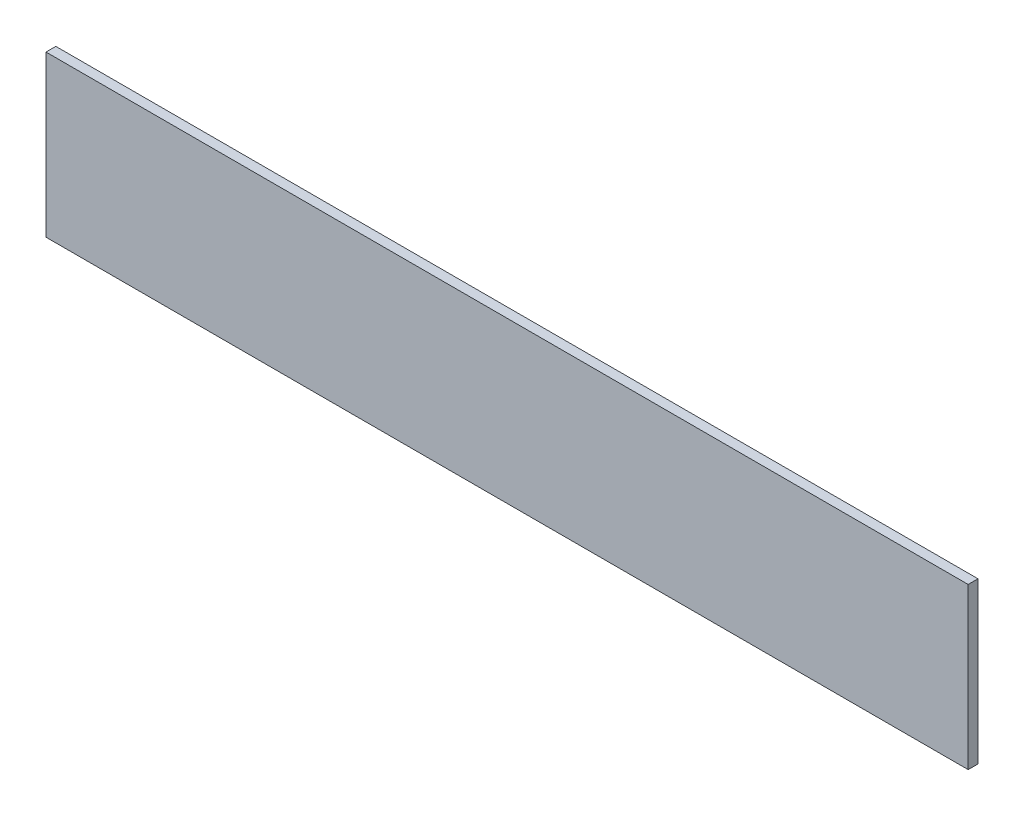
ISO-10303-21;
HEADER;
FILE_DESCRIPTION(('STEP AP214'),'2;1');
FILE_NAME('part.step','',(''),(''),'','','');
FILE_SCHEMA(('AUTOMOTIVE_DESIGN { 1 0 10303 214 1 1 1 1 }'));
ENDSEC;
DATA;
#1=APPLICATION_CONTEXT('core data for automotive mechanical design processes');
#2=APPLICATION_PROTOCOL_DEFINITION('international standard','automotive_design',2000,#1);
#3=PRODUCT_CONTEXT('',#1,'mechanical');
#4=PRODUCT('Part','Part','',(#3));
#5=PRODUCT_RELATED_PRODUCT_CATEGORY('part','',(#4));
#6=PRODUCT_DEFINITION_FORMATION('','',#4);
#7=PRODUCT_DEFINITION_CONTEXT('part definition',#1,'design');
#8=PRODUCT_DEFINITION('design','',#6,#7);
#9=PRODUCT_DEFINITION_SHAPE('','',#8);
#10=(LENGTH_UNIT() NAMED_UNIT(*) SI_UNIT(.MILLI.,.METRE.));
#11=(NAMED_UNIT(*) PLANE_ANGLE_UNIT() SI_UNIT($,.RADIAN.));
#12=(NAMED_UNIT(*) SI_UNIT($,.STERADIAN.) SOLID_ANGLE_UNIT());
#13=UNCERTAINTY_MEASURE_WITH_UNIT(LENGTH_MEASURE(1.E-05),#10,'distance_accuracy_value','');
#14=(GEOMETRIC_REPRESENTATION_CONTEXT(3) GLOBAL_UNCERTAINTY_ASSIGNED_CONTEXT((#13)) GLOBAL_UNIT_ASSIGNED_CONTEXT((#10,
#11,#12)) REPRESENTATION_CONTEXT('',''));
#15=CARTESIAN_POINT('',(0.,0.,0.));
#16=DIRECTION('',(0.,0.,1.));
#17=DIRECTION('',(1.,0.,0.));
#18=AXIS2_PLACEMENT_3D('',#15,#16,#17);
#19=CARTESIAN_POINT('',(-227.6475,59.769375,2.3368));
#20=DIRECTION('',(1.,0.,0.));
#21=DIRECTION('',(0.,0.,-1.));
#22=AXIS2_PLACEMENT_3D('',#19,#20,#21);
#23=PLANE('',#22);
#24=DIRECTION('',(0.,-1.,0.));
#25=VECTOR('',#24,1.);
#26=CARTESIAN_POINT('',(-227.6475,59.769375,0.));
#27=LINE('',#26,#25);
#28=CARTESIAN_POINT('',(-227.6475,59.769375,0.));
#29=VERTEX_POINT('',#28);
#30=CARTESIAN_POINT('',(-227.6475,21.669375,0.));
#31=VERTEX_POINT('',#30);
#32=EDGE_CURVE('E100',#29,#31,#27,.T.);
#33=ORIENTED_EDGE('',*,*,#32,.T.);
#34=DIRECTION('',(0.,0.,-1.));
#35=VECTOR('',#34,1.);
#36=CARTESIAN_POINT('',(-227.6475,21.669375,2.3368));
#37=LINE('',#36,#35);
#38=CARTESIAN_POINT('',(-227.6475,21.669375,2.3368));
#39=VERTEX_POINT('',#38);
#40=EDGE_CURVE('E11',#39,#31,#37,.T.);
#41=ORIENTED_EDGE('',*,*,#40,.F.);
#42=DIRECTION('',(0.,-1.,0.));
#43=VECTOR('',#42,1.);
#44=CARTESIAN_POINT('',(-227.6475,59.769375,2.3368));
#45=LINE('',#44,#43);
#46=CARTESIAN_POINT('',(-227.6475,59.769375,2.3368));
#47=VERTEX_POINT('',#46);
#48=EDGE_CURVE('E88',#47,#39,#45,.T.);
#49=ORIENTED_EDGE('',*,*,#48,.F.);
#50=DIRECTION('',(0.,0.,-1.));
#51=VECTOR('',#50,1.);
#52=CARTESIAN_POINT('',(-227.6475,59.769375,2.3368));
#53=LINE('',#52,#51);
#54=EDGE_CURVE('E96',#47,#29,#53,.T.);
#55=ORIENTED_EDGE('',*,*,#54,.T.);
#56=EDGE_LOOP('',(#33,#41,#49,#55));
#57=FACE_BOUND('',#56,.T.);
#58=ADVANCED_FACE('F37',(#57),#23,.F.);
#59=CARTESIAN_POINT('',(-227.6475,21.669375,2.3368));
#60=DIRECTION('',(0.,1.,0.));
#61=DIRECTION('',(0.,0.,1.));
#62=AXIS2_PLACEMENT_3D('',#59,#60,#61);
#63=PLANE('',#62);
#64=DIRECTION('',(1.,0.,0.));
#65=VECTOR('',#64,1.);
#66=CARTESIAN_POINT('',(-227.6475,21.669375,0.));
#67=LINE('',#66,#65);
#68=CARTESIAN_POINT('',(-8.57249999999987,21.669375,0.));
#69=VERTEX_POINT('',#68);
#70=EDGE_CURVE('E92',#31,#69,#67,.T.);
#71=ORIENTED_EDGE('',*,*,#70,.T.);
#72=DIRECTION('',(0.,0.,-1.));
#73=VECTOR('',#72,1.);
#74=CARTESIAN_POINT('',(-8.57249999999987,21.669375,2.3368));
#75=LINE('',#74,#73);
#76=CARTESIAN_POINT('',(-8.57249999999987,21.669375,2.3368));
#77=VERTEX_POINT('',#76);
#78=EDGE_CURVE('E45',#77,#69,#75,.T.);
#79=ORIENTED_EDGE('',*,*,#78,.F.);
#80=DIRECTION('',(1.,0.,0.));
#81=VECTOR('',#80,1.);
#82=CARTESIAN_POINT('',(-227.6475,21.669375,2.3368));
#83=LINE('',#82,#81);
#84=EDGE_CURVE('E83',#39,#77,#83,.T.);
#85=ORIENTED_EDGE('',*,*,#84,.F.);
#86=ORIENTED_EDGE('',*,*,#40,.T.);
#87=EDGE_LOOP('',(#71,#79,#85,#86));
#88=FACE_BOUND('',#87,.T.);
#89=ADVANCED_FACE('F91',(#88),#63,.F.);
#90=CARTESIAN_POINT('',(-8.57249999999987,59.769375,2.3368));
#91=DIRECTION('',(-1.,0.,0.));
#92=DIRECTION('',(0.,0.,1.));
#93=AXIS2_PLACEMENT_3D('',#90,#91,#92);
#94=PLANE('',#93);
#95=DIRECTION('',(0.,1.,0.));
#96=VECTOR('',#95,1.);
#97=CARTESIAN_POINT('',(-8.57249999999987,59.769375,0.));
#98=LINE('',#97,#96);
#99=CARTESIAN_POINT('',(-8.57249999999987,59.769375,0.));
#100=VERTEX_POINT('',#99);
#101=EDGE_CURVE('E70',#69,#100,#98,.T.);
#102=ORIENTED_EDGE('',*,*,#101,.T.);
#103=DIRECTION('',(0.,0.,-1.));
#104=VECTOR('',#103,1.);
#105=CARTESIAN_POINT('',(-8.57249999999987,59.769375,2.3368));
#106=LINE('',#105,#104);
#107=CARTESIAN_POINT('',(-8.57249999999987,59.769375,2.3368));
#108=VERTEX_POINT('',#107);
#109=EDGE_CURVE('E93',#108,#100,#106,.T.);
#110=ORIENTED_EDGE('',*,*,#109,.F.);
#111=DIRECTION('',(0.,1.,0.));
#112=VECTOR('',#111,1.);
#113=CARTESIAN_POINT('',(-8.57249999999987,59.769375,2.3368));
#114=LINE('',#113,#112);
#115=EDGE_CURVE('E86',#77,#108,#114,.T.);
#116=ORIENTED_EDGE('',*,*,#115,.F.);
#117=ORIENTED_EDGE('',*,*,#78,.T.);
#118=EDGE_LOOP('',(#102,#110,#116,#117));
#119=FACE_BOUND('',#118,.T.);
#120=ADVANCED_FACE('F94',(#119),#94,.F.);
#121=CARTESIAN_POINT('',(-227.6475,59.769375,2.3368));
#122=DIRECTION('',(0.,-1.,0.));
#123=DIRECTION('',(1.,0.,0.));
#124=AXIS2_PLACEMENT_3D('',#121,#122,#123);
#125=PLANE('',#124);
#126=DIRECTION('',(-1.,0.,0.));
#127=VECTOR('',#126,1.);
#128=CARTESIAN_POINT('',(-227.6475,59.769375,0.));
#129=LINE('',#128,#127);
#130=EDGE_CURVE('E76',#100,#29,#129,.T.);
#131=ORIENTED_EDGE('',*,*,#130,.T.);
#132=ORIENTED_EDGE('',*,*,#54,.F.);
#133=DIRECTION('',(-1.,0.,0.));
#134=VECTOR('',#133,1.);
#135=CARTESIAN_POINT('',(-227.6475,59.769375,2.3368));
#136=LINE('',#135,#134);
#137=EDGE_CURVE('E53',#108,#47,#136,.T.);
#138=ORIENTED_EDGE('',*,*,#137,.F.);
#139=ORIENTED_EDGE('',*,*,#109,.T.);
#140=EDGE_LOOP('',(#131,#132,#138,#139));
#141=FACE_BOUND('',#140,.T.);
#142=ADVANCED_FACE('F107',(#141),#125,.F.);
#143=CARTESIAN_POINT('',(0.,0.,2.3368));
#144=DIRECTION('',(0.,0.,1.));
#145=DIRECTION('',(1.,0.,0.));
#146=AXIS2_PLACEMENT_3D('',#143,#144,#145);
#147=PLANE('',#146);
#148=ORIENTED_EDGE('',*,*,#48,.T.);
#149=ORIENTED_EDGE('',*,*,#84,.T.);
#150=ORIENTED_EDGE('',*,*,#115,.T.);
#151=ORIENTED_EDGE('',*,*,#137,.T.);
#152=EDGE_LOOP('',(#148,#149,#150,#151));
#153=FACE_BOUND('',#152,.T.);
#154=ADVANCED_FACE('F84',(#153),#147,.T.);
#155=CARTESIAN_POINT('',(0.,0.,0.));
#156=DIRECTION('',(0.,0.,1.));
#157=DIRECTION('',(1.,0.,0.));
#158=AXIS2_PLACEMENT_3D('',#155,#156,#157);
#159=PLANE('',#158);
#160=ORIENTED_EDGE('',*,*,#32,.F.);
#161=ORIENTED_EDGE('',*,*,#130,.F.);
#162=ORIENTED_EDGE('',*,*,#101,.F.);
#163=ORIENTED_EDGE('',*,*,#70,.F.);
#164=EDGE_LOOP('',(#160,#161,#162,#163));
#165=FACE_BOUND('',#164,.T.);
#166=ADVANCED_FACE('F110',(#165),#159,.F.);
#167=CLOSED_SHELL('',(#58,#89,#120,#142,#154,#166));
#168=MANIFOLD_SOLID_BREP('B2',#167);
#169=ADVANCED_BREP_SHAPE_REPRESENTATION('',(#18,#168),#14);
#170=SHAPE_DEFINITION_REPRESENTATION(#9,#169);
ENDSEC;
END-ISO-10303-21;
